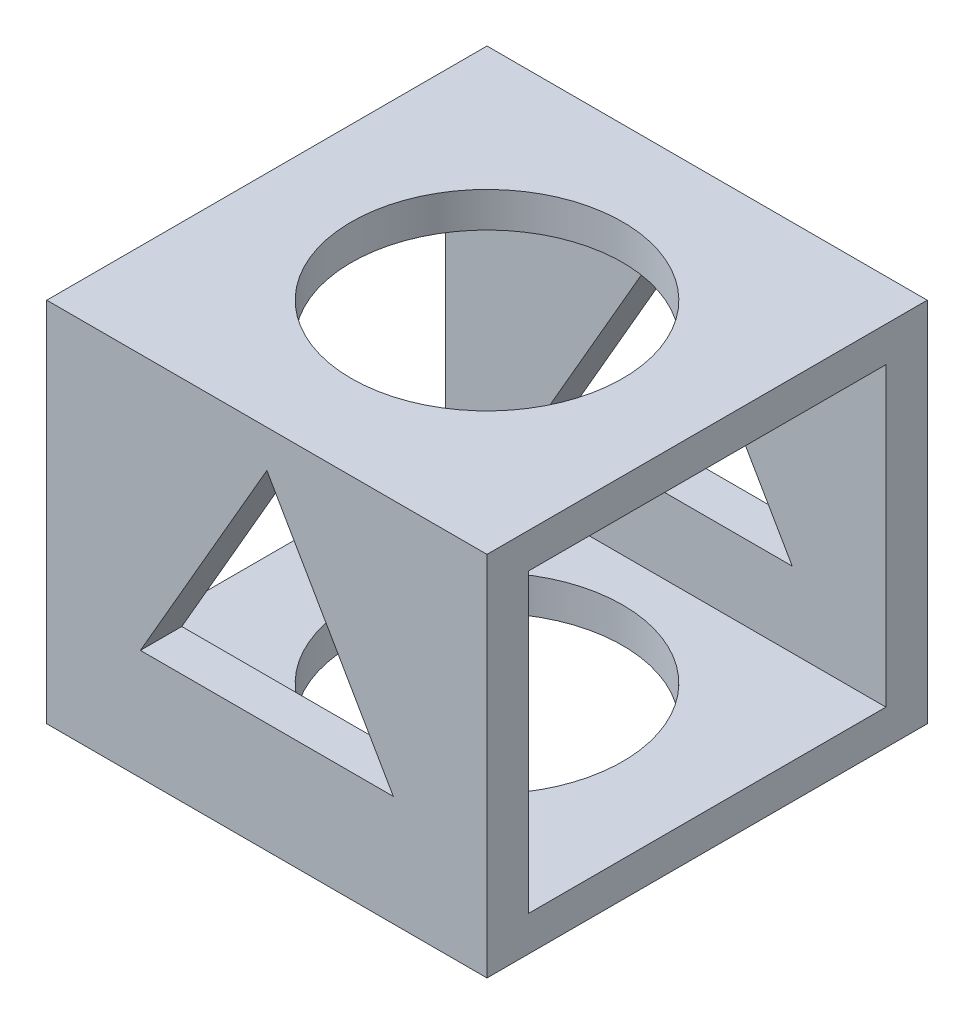
ISO-10303-21;
HEADER;
FILE_DESCRIPTION(('STEP AP214'),'2;1');
FILE_NAME('part.step','',(''),(''),'','','');
FILE_SCHEMA(('AUTOMOTIVE_DESIGN { 1 0 10303 214 1 1 1 1 }'));
ENDSEC;
DATA;
#1=APPLICATION_CONTEXT('core data for automotive mechanical design processes');
#2=APPLICATION_PROTOCOL_DEFINITION('international standard','automotive_design',2000,#1);
#3=PRODUCT_CONTEXT('',#1,'mechanical');
#4=PRODUCT('Part','Part','',(#3));
#5=PRODUCT_RELATED_PRODUCT_CATEGORY('part','',(#4));
#6=PRODUCT_DEFINITION_FORMATION('','',#4);
#7=PRODUCT_DEFINITION_CONTEXT('part definition',#1,'design');
#8=PRODUCT_DEFINITION('design','',#6,#7);
#9=PRODUCT_DEFINITION_SHAPE('','',#8);
#10=(LENGTH_UNIT() NAMED_UNIT(*) SI_UNIT(.MILLI.,.METRE.));
#11=(NAMED_UNIT(*) PLANE_ANGLE_UNIT() SI_UNIT($,.RADIAN.));
#12=(NAMED_UNIT(*) SI_UNIT($,.STERADIAN.) SOLID_ANGLE_UNIT());
#13=UNCERTAINTY_MEASURE_WITH_UNIT(LENGTH_MEASURE(1.E-05),#10,'distance_accuracy_value','');
#14=(GEOMETRIC_REPRESENTATION_CONTEXT(3) GLOBAL_UNCERTAINTY_ASSIGNED_CONTEXT((#13)) GLOBAL_UNIT_ASSIGNED_CONTEXT((#10,
#11,#12)) REPRESENTATION_CONTEXT('',''));
#15=CARTESIAN_POINT('',(0.,0.,0.));
#16=DIRECTION('',(0.,0.,1.));
#17=DIRECTION('',(1.,0.,0.));
#18=AXIS2_PLACEMENT_3D('',#15,#16,#17);
#19=CARTESIAN_POINT('',(43.7781022598842,-25.2752991243551,-76.2));
#20=DIRECTION('',(0.866025403784438,0.5,0.));
#21=DIRECTION('',(-0.5,0.866025403784438,0.));
#22=AXIS2_PLACEMENT_3D('',#19,#20,#21);
#23=PLANE('',#22);
#24=DIRECTION('',(0.,0.,1.));
#25=VECTOR('',#24,1.);
#26=CARTESIAN_POINT('',(43.7781022598842,-25.2752991243551,-76.2));
#27=LINE('',#26,#25);
#28=CARTESIAN_POINT('',(43.7781022598842,-25.2752991243551,-76.2));
#29=VERTEX_POINT('',#28);
#30=CARTESIAN_POINT('',(43.7781022598842,-25.2752991243551,-61.884513845509));
#31=VERTEX_POINT('',#30);
#32=EDGE_CURVE('E206',#29,#31,#27,.T.);
#33=ORIENTED_EDGE('',*,*,#32,.T.);
#34=DIRECTION('',(-0.5,0.866025403784438,0.));
#35=VECTOR('',#34,1.);
#36=CARTESIAN_POINT('',(43.7781022598842,-25.2752991243551,-61.884513845509));
#37=LINE('',#36,#35);
#38=CARTESIAN_POINT('',(0.,50.5505982487102,-61.884513845509));
#39=VERTEX_POINT('',#38);
#40=EDGE_CURVE('E184',#31,#39,#37,.T.);
#41=ORIENTED_EDGE('',*,*,#40,.T.);
#42=DIRECTION('',(0.,0.,1.));
#43=VECTOR('',#42,1.);
#44=CARTESIAN_POINT('',(0.,50.5505982487102,-76.2));
#45=LINE('',#44,#43);
#46=CARTESIAN_POINT('',(0.,50.5505982487102,-76.2));
#47=VERTEX_POINT('',#46);
#48=EDGE_CURVE('E215',#47,#39,#45,.T.);
#49=ORIENTED_EDGE('',*,*,#48,.F.);
#50=DIRECTION('',(-0.5,0.866025403784438,0.));
#51=VECTOR('',#50,1.);
#52=CARTESIAN_POINT('',(43.7781022598842,-25.2752991243551,-76.2));
#53=LINE('',#52,#51);
#54=EDGE_CURVE('E188',#29,#47,#53,.T.);
#55=ORIENTED_EDGE('',*,*,#54,.F.);
#56=EDGE_LOOP('',(#33,#41,#49,#55));
#57=FACE_BOUND('',#56,.T.);
#58=ADVANCED_FACE('F33',(#57),#23,.F.);
#59=CARTESIAN_POINT('',(-43.7781022598842,-25.2752991243551,-76.2));
#60=DIRECTION('',(0.,-1.,0.));
#61=DIRECTION('',(0.,0.,-1.));
#62=AXIS2_PLACEMENT_3D('',#59,#60,#61);
#63=PLANE('',#62);
#64=DIRECTION('',(0.,0.,1.));
#65=VECTOR('',#64,1.);
#66=CARTESIAN_POINT('',(-43.7781022598842,-25.2752991243551,-76.2));
#67=LINE('',#66,#65);
#68=CARTESIAN_POINT('',(-43.7781022598842,-25.2752991243551,-76.2));
#69=VERTEX_POINT('',#68);
#70=CARTESIAN_POINT('',(-43.7781022598842,-25.2752991243551,-61.884513845509));
#71=VERTEX_POINT('',#70);
#72=EDGE_CURVE('E211',#69,#71,#67,.T.);
#73=ORIENTED_EDGE('',*,*,#72,.T.);
#74=DIRECTION('',(1.,0.,0.));
#75=VECTOR('',#74,1.);
#76=CARTESIAN_POINT('',(-43.7781022598842,-25.2752991243551,-61.884513845509));
#77=LINE('',#76,#75);
#78=EDGE_CURVE('E181',#71,#31,#77,.T.);
#79=ORIENTED_EDGE('',*,*,#78,.T.);
#80=ORIENTED_EDGE('',*,*,#32,.F.);
#81=DIRECTION('',(1.,0.,0.));
#82=VECTOR('',#81,1.);
#83=CARTESIAN_POINT('',(-43.7781022598842,-25.2752991243551,-76.2));
#84=LINE('',#83,#82);
#85=EDGE_CURVE('E195',#69,#29,#84,.T.);
#86=ORIENTED_EDGE('',*,*,#85,.F.);
#87=EDGE_LOOP('',(#73,#79,#80,#86));
#88=FACE_BOUND('',#87,.T.);
#89=ADVANCED_FACE('F277',(#88),#63,.F.);
#90=CARTESIAN_POINT('',(0.,50.5505982487102,-76.2));
#91=DIRECTION('',(-0.866025403784439,0.5,0.));
#92=DIRECTION('',(-0.5,-0.866025403784439,0.));
#93=AXIS2_PLACEMENT_3D('',#90,#91,#92);
#94=PLANE('',#93);
#95=ORIENTED_EDGE('',*,*,#48,.T.);
#96=DIRECTION('',(-0.5,-0.866025403784439,0.));
#97=VECTOR('',#96,1.);
#98=CARTESIAN_POINT('',(0.,50.5505982487102,-61.884513845509));
#99=LINE('',#98,#97);
#100=EDGE_CURVE('E11',#39,#71,#99,.T.);
#101=ORIENTED_EDGE('',*,*,#100,.T.);
#102=ORIENTED_EDGE('',*,*,#72,.F.);
#103=DIRECTION('',(-0.5,-0.866025403784439,0.));
#104=VECTOR('',#103,1.);
#105=CARTESIAN_POINT('',(0.,50.5505982487102,-76.2));
#106=LINE('',#105,#104);
#107=EDGE_CURVE('E191',#47,#69,#106,.T.);
#108=ORIENTED_EDGE('',*,*,#107,.F.);
#109=EDGE_LOOP('',(#95,#101,#102,#108));
#110=FACE_BOUND('',#109,.T.);
#111=ADVANCED_FACE('F283',(#110),#94,.F.);
#112=CARTESIAN_POINT('',(76.2,-63.5,76.2));
#113=DIRECTION('',(-1.,0.,0.));
#114=DIRECTION('',(0.,0.,1.));
#115=AXIS2_PLACEMENT_3D('',#112,#113,#114);
#116=PLANE('',#115);
#117=DIRECTION('',(0.,0.,1.));
#118=VECTOR('',#117,1.);
#119=CARTESIAN_POINT('',(76.2,51.3319522360152,61.884513845509));
#120=LINE('',#119,#118);
#121=CARTESIAN_POINT('',(76.2,51.3319522360152,-61.884513845509));
#122=VERTEX_POINT('',#121);
#123=CARTESIAN_POINT('',(76.2,51.3319522360152,61.884513845509));
#124=VERTEX_POINT('',#123);
#125=EDGE_CURVE('E166',#122,#124,#120,.T.);
#126=ORIENTED_EDGE('',*,*,#125,.F.);
#127=DIRECTION('',(0.,1.,0.));
#128=VECTOR('',#127,1.);
#129=CARTESIAN_POINT('',(76.2,-51.3319522360152,-61.884513845509));
#130=LINE('',#129,#128);
#131=CARTESIAN_POINT('',(76.2,-51.3319522360152,-61.884513845509));
#132=VERTEX_POINT('',#131);
#133=EDGE_CURVE('E49',#132,#122,#130,.T.);
#134=ORIENTED_EDGE('',*,*,#133,.F.);
#135=DIRECTION('',(0.,0.,-1.));
#136=VECTOR('',#135,1.);
#137=CARTESIAN_POINT('',(76.2,-51.3319522360152,61.884513845509));
#138=LINE('',#137,#136);
#139=CARTESIAN_POINT('',(76.2,-51.3319522360152,61.884513845509));
#140=VERTEX_POINT('',#139);
#141=EDGE_CURVE('E154',#140,#132,#138,.T.);
#142=ORIENTED_EDGE('',*,*,#141,.F.);
#143=DIRECTION('',(0.,-1.,0.));
#144=VECTOR('',#143,1.);
#145=CARTESIAN_POINT('',(76.2,-51.3319522360152,61.884513845509));
#146=LINE('',#145,#144);
#147=EDGE_CURVE('E157',#124,#140,#146,.T.);
#148=ORIENTED_EDGE('',*,*,#147,.F.);
#149=EDGE_LOOP('',(#126,#134,#142,#148));
#150=FACE_BOUND('',#149,.T.);
#151=DIRECTION('',(0.,1.,0.));
#152=VECTOR('',#151,1.);
#153=CARTESIAN_POINT('',(76.2,-63.5,-76.2));
#154=LINE('',#153,#152);
#155=CARTESIAN_POINT('',(76.2,-63.5,-76.2));
#156=VERTEX_POINT('',#155);
#157=CARTESIAN_POINT('',(76.2,63.5,-76.2));
#158=VERTEX_POINT('',#157);
#159=EDGE_CURVE('E209',#156,#158,#154,.T.);
#160=ORIENTED_EDGE('',*,*,#159,.T.);
#161=DIRECTION('',(0.,0.,-1.));
#162=VECTOR('',#161,1.);
#163=CARTESIAN_POINT('',(76.2,63.5,76.2));
#164=LINE('',#163,#162);
#165=CARTESIAN_POINT('',(76.2,63.5,76.2));
#166=VERTEX_POINT('',#165);
#167=EDGE_CURVE('E244',#166,#158,#164,.T.);
#168=ORIENTED_EDGE('',*,*,#167,.F.);
#169=DIRECTION('',(0.,1.,0.));
#170=VECTOR('',#169,1.);
#171=CARTESIAN_POINT('',(76.2,-63.5,76.2));
#172=LINE('',#171,#170);
#173=CARTESIAN_POINT('',(76.2,-63.5,76.2));
#174=VERTEX_POINT('',#173);
#175=EDGE_CURVE('E218',#174,#166,#172,.T.);
#176=ORIENTED_EDGE('',*,*,#175,.F.);
#177=DIRECTION('',(0.,0.,-1.));
#178=VECTOR('',#177,1.);
#179=CARTESIAN_POINT('',(76.2,-63.5,76.2));
#180=LINE('',#179,#178);
#181=EDGE_CURVE('E228',#174,#156,#180,.T.);
#182=ORIENTED_EDGE('',*,*,#181,.T.);
#183=EDGE_LOOP('',(#160,#168,#176,#182));
#184=FACE_BOUND('',#183,.T.);
#185=ADVANCED_FACE('F35',(#150,#184),#116,.F.);
#186=CARTESIAN_POINT('',(-76.2,63.5,76.2));
#187=DIRECTION('',(0.,-1.,0.));
#188=DIRECTION('',(0.,0.,-1.));
#189=AXIS2_PLACEMENT_3D('',#186,#187,#188);
#190=PLANE('',#189);
#191=CARTESIAN_POINT('',(0.,63.5,0.));
#192=DIRECTION('',(0.,1.,0.));
#193=DIRECTION('',(0.,0.,1.));
#194=AXIS2_PLACEMENT_3D('',#191,#192,#193);
#195=CIRCLE('',#194,46.9608561348397);
#196=CARTESIAN_POINT('',(0.,63.5,46.9608561348397));
#197=VERTEX_POINT('',#196);
#198=EDGE_CURVE('E316',#197,#197,#195,.T.);
#199=ORIENTED_EDGE('',*,*,#198,.F.);
#200=EDGE_LOOP('',(#199));
#201=FACE_BOUND('',#200,.T.);
#202=DIRECTION('',(-1.,0.,0.));
#203=VECTOR('',#202,1.);
#204=CARTESIAN_POINT('',(-76.2,63.5,-76.2));
#205=LINE('',#204,#203);
#206=CARTESIAN_POINT('',(-76.2,63.5,-76.2));
#207=VERTEX_POINT('',#206);
#208=EDGE_CURVE('E231',#158,#207,#205,.T.);
#209=ORIENTED_EDGE('',*,*,#208,.T.);
#210=DIRECTION('',(0.,0.,-1.));
#211=VECTOR('',#210,1.);
#212=CARTESIAN_POINT('',(-76.2,63.5,76.2));
#213=LINE('',#212,#211);
#214=CARTESIAN_POINT('',(-76.2,63.5,76.2));
#215=VERTEX_POINT('',#214);
#216=EDGE_CURVE('E241',#215,#207,#213,.T.);
#217=ORIENTED_EDGE('',*,*,#216,.F.);
#218=DIRECTION('',(-1.,0.,0.));
#219=VECTOR('',#218,1.);
#220=CARTESIAN_POINT('',(-76.2,63.5,76.2));
#221=LINE('',#220,#219);
#222=EDGE_CURVE('E221',#166,#215,#221,.T.);
#223=ORIENTED_EDGE('',*,*,#222,.F.);
#224=ORIENTED_EDGE('',*,*,#167,.T.);
#225=EDGE_LOOP('',(#209,#217,#223,#224));
#226=FACE_BOUND('',#225,.T.);
#227=ADVANCED_FACE('F306',(#201,#226),#190,.F.);
#228=CARTESIAN_POINT('',(-76.2,-63.5,76.2));
#229=DIRECTION('',(1.,0.,0.));
#230=DIRECTION('',(0.,0.,-1.));
#231=AXIS2_PLACEMENT_3D('',#228,#229,#230);
#232=PLANE('',#231);
#233=DIRECTION('',(0.,0.,-1.));
#234=VECTOR('',#233,1.);
#235=CARTESIAN_POINT('',(-76.2,-51.3319522360152,61.884513845509));
#236=LINE('',#235,#234);
#237=CARTESIAN_POINT('',(-76.2,-51.3319522360152,61.884513845509));
#238=VERTEX_POINT('',#237);
#239=CARTESIAN_POINT('',(-76.2,-51.3319522360152,-61.884513845509));
#240=VERTEX_POINT('',#239);
#241=EDGE_CURVE('E144',#238,#240,#236,.T.);
#242=ORIENTED_EDGE('',*,*,#241,.T.);
#243=DIRECTION('',(0.,1.,0.));
#244=VECTOR('',#243,1.);
#245=CARTESIAN_POINT('',(-76.2,-51.3319522360152,-61.884513845509));
#246=LINE('',#245,#244);
#247=CARTESIAN_POINT('',(-76.2,51.3319522360152,-61.884513845509));
#248=VERTEX_POINT('',#247);
#249=EDGE_CURVE('E138',#240,#248,#246,.T.);
#250=ORIENTED_EDGE('',*,*,#249,.T.);
#251=DIRECTION('',(0.,0.,1.));
#252=VECTOR('',#251,1.);
#253=CARTESIAN_POINT('',(-76.2,51.3319522360152,61.884513845509));
#254=LINE('',#253,#252);
#255=CARTESIAN_POINT('',(-76.2,51.3319522360152,61.884513845509));
#256=VERTEX_POINT('',#255);
#257=EDGE_CURVE('E147',#248,#256,#254,.T.);
#258=ORIENTED_EDGE('',*,*,#257,.T.);
#259=DIRECTION('',(0.,-1.,0.));
#260=VECTOR('',#259,1.);
#261=CARTESIAN_POINT('',(-76.2,-51.3319522360152,61.884513845509));
#262=LINE('',#261,#260);
#263=EDGE_CURVE('E57',#256,#238,#262,.T.);
#264=ORIENTED_EDGE('',*,*,#263,.T.);
#265=EDGE_LOOP('',(#242,#250,#258,#264));
#266=FACE_BOUND('',#265,.T.);
#267=DIRECTION('',(0.,-1.,0.));
#268=VECTOR('',#267,1.);
#269=CARTESIAN_POINT('',(-76.2,-63.5,-76.2));
#270=LINE('',#269,#268);
#271=CARTESIAN_POINT('',(-76.2,-63.5,-76.2));
#272=VERTEX_POINT('',#271);
#273=EDGE_CURVE('E233',#207,#272,#270,.T.);
#274=ORIENTED_EDGE('',*,*,#273,.T.);
#275=DIRECTION('',(0.,0.,-1.));
#276=VECTOR('',#275,1.);
#277=CARTESIAN_POINT('',(-76.2,-63.5,76.2));
#278=LINE('',#277,#276);
#279=CARTESIAN_POINT('',(-76.2,-63.5,76.2));
#280=VERTEX_POINT('',#279);
#281=EDGE_CURVE('E238',#280,#272,#278,.T.);
#282=ORIENTED_EDGE('',*,*,#281,.F.);
#283=DIRECTION('',(0.,-1.,0.));
#284=VECTOR('',#283,1.);
#285=CARTESIAN_POINT('',(-76.2,-63.5,76.2));
#286=LINE('',#285,#284);
#287=EDGE_CURVE('E224',#215,#280,#286,.T.);
#288=ORIENTED_EDGE('',*,*,#287,.F.);
#289=ORIENTED_EDGE('',*,*,#216,.T.);
#290=EDGE_LOOP('',(#274,#282,#288,#289));
#291=FACE_BOUND('',#290,.T.);
#292=ADVANCED_FACE('F151',(#266,#291),#232,.F.);
#293=CARTESIAN_POINT('',(-76.2,-63.5,76.2));
#294=DIRECTION('',(0.,1.,0.));
#295=DIRECTION('',(0.,0.,1.));
#296=AXIS2_PLACEMENT_3D('',#293,#294,#295);
#297=PLANE('',#296);
#298=CARTESIAN_POINT('',(0.,-63.5,0.));
#299=DIRECTION('',(0.,1.,0.));
#300=DIRECTION('',(0.,0.,1.));
#301=AXIS2_PLACEMENT_3D('',#298,#299,#300);
#302=CIRCLE('',#301,46.9608561348397);
#303=CARTESIAN_POINT('',(0.,-63.5,46.9608561348397));
#304=VERTEX_POINT('',#303);
#305=EDGE_CURVE('E330',#304,#304,#302,.T.);
#306=ORIENTED_EDGE('',*,*,#305,.T.);
#307=EDGE_LOOP('',(#306));
#308=FACE_BOUND('',#307,.T.);
#309=DIRECTION('',(1.,0.,0.));
#310=VECTOR('',#309,1.);
#311=CARTESIAN_POINT('',(-76.2,-63.5,-76.2));
#312=LINE('',#311,#310);
#313=EDGE_CURVE('E222',#272,#156,#312,.T.);
#314=ORIENTED_EDGE('',*,*,#313,.T.);
#315=ORIENTED_EDGE('',*,*,#181,.F.);
#316=DIRECTION('',(1.,0.,0.));
#317=VECTOR('',#316,1.);
#318=CARTESIAN_POINT('',(-76.2,-63.5,76.2));
#319=LINE('',#318,#317);
#320=EDGE_CURVE('E226',#280,#174,#319,.T.);
#321=ORIENTED_EDGE('',*,*,#320,.F.);
#322=ORIENTED_EDGE('',*,*,#281,.T.);
#323=EDGE_LOOP('',(#314,#315,#321,#322));
#324=FACE_BOUND('',#323,.T.);
#325=ADVANCED_FACE('F299',(#308,#324),#297,.F.);
#326=CARTESIAN_POINT('',(0.,0.,76.2));
#327=DIRECTION('',(0.,0.,-1.));
#328=DIRECTION('',(-1.,0.,0.));
#329=AXIS2_PLACEMENT_3D('',#326,#327,#328);
#330=PLANE('',#329);
#331=DIRECTION('',(-0.5,-0.866025403784439,0.));
#332=VECTOR('',#331,1.);
#333=CARTESIAN_POINT('',(0.,50.5505982487102,76.2));
#334=LINE('',#333,#332);
#335=CARTESIAN_POINT('',(0.,50.5505982487102,76.2));
#336=VERTEX_POINT('',#335);
#337=CARTESIAN_POINT('',(-43.7781022598842,-25.2752991243551,76.2));
#338=VERTEX_POINT('',#337);
#339=EDGE_CURVE('E201',#336,#338,#334,.T.);
#340=ORIENTED_EDGE('',*,*,#339,.F.);
#341=DIRECTION('',(-0.5,0.866025403784438,0.));
#342=VECTOR('',#341,1.);
#343=CARTESIAN_POINT('',(43.7781022598842,-25.2752991243551,76.2));
#344=LINE('',#343,#342);
#345=CARTESIAN_POINT('',(43.7781022598842,-25.2752991243551,76.2));
#346=VERTEX_POINT('',#345);
#347=EDGE_CURVE('E187',#346,#336,#344,.T.);
#348=ORIENTED_EDGE('',*,*,#347,.F.);
#349=DIRECTION('',(1.,0.,0.));
#350=VECTOR('',#349,1.);
#351=CARTESIAN_POINT('',(-43.7781022598842,-25.2752991243551,76.2));
#352=LINE('',#351,#350);
#353=EDGE_CURVE('E192',#338,#346,#352,.T.);
#354=ORIENTED_EDGE('',*,*,#353,.F.);
#355=EDGE_LOOP('',(#340,#348,#354));
#356=FACE_BOUND('',#355,.T.);
#357=ORIENTED_EDGE('',*,*,#175,.T.);
#358=ORIENTED_EDGE('',*,*,#222,.T.);
#359=ORIENTED_EDGE('',*,*,#287,.T.);
#360=ORIENTED_EDGE('',*,*,#320,.T.);
#361=EDGE_LOOP('',(#357,#358,#359,#360));
#362=FACE_BOUND('',#361,.T.);
#363=ADVANCED_FACE('F260',(#356,#362),#330,.F.);
#364=CARTESIAN_POINT('',(0.,0.,-76.2));
#365=DIRECTION('',(0.,0.,-1.));
#366=DIRECTION('',(-1.,0.,0.));
#367=AXIS2_PLACEMENT_3D('',#364,#365,#366);
#368=PLANE('',#367);
#369=ORIENTED_EDGE('',*,*,#54,.T.);
#370=ORIENTED_EDGE('',*,*,#107,.T.);
#371=ORIENTED_EDGE('',*,*,#85,.T.);
#372=EDGE_LOOP('',(#369,#370,#371));
#373=FACE_BOUND('',#372,.T.);
#374=ORIENTED_EDGE('',*,*,#159,.F.);
#375=ORIENTED_EDGE('',*,*,#313,.F.);
#376=ORIENTED_EDGE('',*,*,#273,.F.);
#377=ORIENTED_EDGE('',*,*,#208,.F.);
#378=EDGE_LOOP('',(#374,#375,#376,#377));
#379=FACE_BOUND('',#378,.T.);
#380=ADVANCED_FACE('F289',(#373,#379),#368,.T.);
#381=CARTESIAN_POINT('',(0.,50.5505982487102,61.884513845509));
#382=VERTEX_POINT('',#381);
#383=EDGE_CURVE('E198',#382,#336,#45,.T.);
#384=ORIENTED_EDGE('',*,*,#383,.F.);
#385=DIRECTION('',(0.5,-0.866025403784438,0.));
#386=VECTOR('',#385,1.);
#387=CARTESIAN_POINT('',(43.7781022598842,-25.2752991243551,61.884513845509));
#388=LINE('',#387,#386);
#389=CARTESIAN_POINT('',(43.7781022598842,-25.2752991243551,61.884513845509));
#390=VERTEX_POINT('',#389);
#391=EDGE_CURVE('E178',#382,#390,#388,.T.);
#392=ORIENTED_EDGE('',*,*,#391,.T.);
#393=EDGE_CURVE('E210',#390,#346,#27,.T.);
#394=ORIENTED_EDGE('',*,*,#393,.T.);
#395=ORIENTED_EDGE('',*,*,#347,.T.);
#396=EDGE_LOOP('',(#384,#392,#394,#395));
#397=FACE_BOUND('',#396,.T.);
#398=ADVANCED_FACE('F254',(#397),#23,.F.);
#399=ORIENTED_EDGE('',*,*,#393,.F.);
#400=DIRECTION('',(-1.,0.,0.));
#401=VECTOR('',#400,1.);
#402=CARTESIAN_POINT('',(-43.7781022598842,-25.2752991243551,61.884513845509));
#403=LINE('',#402,#401);
#404=CARTESIAN_POINT('',(-43.7781022598842,-25.2752991243551,61.884513845509));
#405=VERTEX_POINT('',#404);
#406=EDGE_CURVE('E172',#390,#405,#403,.T.);
#407=ORIENTED_EDGE('',*,*,#406,.T.);
#408=EDGE_CURVE('E214',#405,#338,#67,.T.);
#409=ORIENTED_EDGE('',*,*,#408,.T.);
#410=ORIENTED_EDGE('',*,*,#353,.T.);
#411=EDGE_LOOP('',(#399,#407,#409,#410));
#412=FACE_BOUND('',#411,.T.);
#413=ADVANCED_FACE('F263',(#412),#63,.F.);
#414=ORIENTED_EDGE('',*,*,#408,.F.);
#415=DIRECTION('',(0.5,0.866025403784439,0.));
#416=VECTOR('',#415,1.);
#417=CARTESIAN_POINT('',(0.,50.5505982487102,61.884513845509));
#418=LINE('',#417,#416);
#419=EDGE_CURVE('E42',#405,#382,#418,.T.);
#420=ORIENTED_EDGE('',*,*,#419,.T.);
#421=ORIENTED_EDGE('',*,*,#383,.T.);
#422=ORIENTED_EDGE('',*,*,#339,.T.);
#423=EDGE_LOOP('',(#414,#420,#421,#422));
#424=FACE_BOUND('',#423,.T.);
#425=ADVANCED_FACE('F251',(#424),#94,.F.);
#426=CARTESIAN_POINT('',(-76.2,-51.3319522360152,-61.884513845509));
#427=DIRECTION('',(0.,0.,-1.));
#428=DIRECTION('',(-1.,0.,0.));
#429=AXIS2_PLACEMENT_3D('',#426,#427,#428);
#430=PLANE('',#429);
#431=ORIENTED_EDGE('',*,*,#133,.T.);
#432=DIRECTION('',(1.,0.,0.));
#433=VECTOR('',#432,1.);
#434=CARTESIAN_POINT('',(-76.2,51.3319522360152,-61.884513845509));
#435=LINE('',#434,#433);
#436=EDGE_CURVE('E133',#248,#122,#435,.T.);
#437=ORIENTED_EDGE('',*,*,#436,.F.);
#438=ORIENTED_EDGE('',*,*,#249,.F.);
#439=DIRECTION('',(1.,0.,0.));
#440=VECTOR('',#439,1.);
#441=CARTESIAN_POINT('',(-76.2,-51.3319522360152,-61.884513845509));
#442=LINE('',#441,#440);
#443=EDGE_CURVE('E170',#240,#132,#442,.T.);
#444=ORIENTED_EDGE('',*,*,#443,.T.);
#445=EDGE_LOOP('',(#431,#437,#438,#444));
#446=FACE_BOUND('',#445,.T.);
#447=ORIENTED_EDGE('',*,*,#78,.F.);
#448=ORIENTED_EDGE('',*,*,#100,.F.);
#449=ORIENTED_EDGE('',*,*,#40,.F.);
#450=EDGE_LOOP('',(#447,#448,#449));
#451=FACE_BOUND('',#450,.T.);
#452=ADVANCED_FACE('F135',(#446,#451),#430,.F.);
#453=CARTESIAN_POINT('',(-76.2,-51.3319522360152,61.884513845509));
#454=DIRECTION('',(0.,0.,1.));
#455=DIRECTION('',(1.,0.,0.));
#456=AXIS2_PLACEMENT_3D('',#453,#454,#455);
#457=PLANE('',#456);
#458=ORIENTED_EDGE('',*,*,#147,.T.);
#459=DIRECTION('',(1.,0.,0.));
#460=VECTOR('',#459,1.);
#461=CARTESIAN_POINT('',(-76.2,-51.3319522360152,61.884513845509));
#462=LINE('',#461,#460);
#463=EDGE_CURVE('E173',#238,#140,#462,.T.);
#464=ORIENTED_EDGE('',*,*,#463,.F.);
#465=ORIENTED_EDGE('',*,*,#263,.F.);
#466=DIRECTION('',(1.,0.,0.));
#467=VECTOR('',#466,1.);
#468=CARTESIAN_POINT('',(-76.2,51.3319522360152,61.884513845509));
#469=LINE('',#468,#467);
#470=EDGE_CURVE('E143',#256,#124,#469,.T.);
#471=ORIENTED_EDGE('',*,*,#470,.T.);
#472=EDGE_LOOP('',(#458,#464,#465,#471));
#473=FACE_BOUND('',#472,.T.);
#474=ORIENTED_EDGE('',*,*,#419,.F.);
#475=ORIENTED_EDGE('',*,*,#406,.F.);
#476=ORIENTED_EDGE('',*,*,#391,.F.);
#477=EDGE_LOOP('',(#474,#475,#476));
#478=FACE_BOUND('',#477,.T.);
#479=ADVANCED_FACE('F264',(#473,#478),#457,.F.);
#480=CARTESIAN_POINT('',(-76.2,-51.3319522360152,61.884513845509));
#481=DIRECTION('',(0.,-1.,0.));
#482=DIRECTION('',(0.,0.,-1.));
#483=AXIS2_PLACEMENT_3D('',#480,#481,#482);
#484=PLANE('',#483);
#485=CARTESIAN_POINT('',(0.,-51.3319522360152,0.));
#486=DIRECTION('',(0.,-1.,0.));
#487=DIRECTION('',(0.,0.,-1.));
#488=AXIS2_PLACEMENT_3D('',#485,#486,#487);
#489=CIRCLE('',#488,46.9608561348397);
#490=CARTESIAN_POINT('',(0.,-51.3319522360152,-46.9608561348397));
#491=VERTEX_POINT('',#490);
#492=EDGE_CURVE('E160',#491,#491,#489,.T.);
#493=ORIENTED_EDGE('',*,*,#492,.T.);
#494=EDGE_LOOP('',(#493));
#495=FACE_BOUND('',#494,.T.);
#496=ORIENTED_EDGE('',*,*,#141,.T.);
#497=ORIENTED_EDGE('',*,*,#443,.F.);
#498=ORIENTED_EDGE('',*,*,#241,.F.);
#499=ORIENTED_EDGE('',*,*,#463,.T.);
#500=EDGE_LOOP('',(#496,#497,#498,#499));
#501=FACE_BOUND('',#500,.T.);
#502=ADVANCED_FACE('F266',(#495,#501),#484,.F.);
#503=CARTESIAN_POINT('',(-76.2,51.3319522360152,61.884513845509));
#504=DIRECTION('',(0.,1.,0.));
#505=DIRECTION('',(0.,0.,1.));
#506=AXIS2_PLACEMENT_3D('',#503,#504,#505);
#507=PLANE('',#506);
#508=CARTESIAN_POINT('',(0.,51.3319522360152,0.));
#509=DIRECTION('',(0.,1.,0.));
#510=DIRECTION('',(0.,0.,1.));
#511=AXIS2_PLACEMENT_3D('',#508,#509,#510);
#512=CIRCLE('',#511,46.9608561348397);
#513=CARTESIAN_POINT('',(0.,51.3319522360152,46.9608561348397));
#514=VERTEX_POINT('',#513);
#515=EDGE_CURVE('E37',#514,#514,#512,.T.);
#516=ORIENTED_EDGE('',*,*,#515,.T.);
#517=EDGE_LOOP('',(#516));
#518=FACE_BOUND('',#517,.T.);
#519=ORIENTED_EDGE('',*,*,#125,.T.);
#520=ORIENTED_EDGE('',*,*,#470,.F.);
#521=ORIENTED_EDGE('',*,*,#257,.F.);
#522=ORIENTED_EDGE('',*,*,#436,.T.);
#523=EDGE_LOOP('',(#519,#520,#521,#522));
#524=FACE_BOUND('',#523,.T.);
#525=ADVANCED_FACE('F148',(#518,#524),#507,.F.);
#526=CARTESIAN_POINT('',(0.,-63.5,0.));
#527=DIRECTION('',(0.,1.,0.));
#528=DIRECTION('',(0.,0.,1.));
#529=AXIS2_PLACEMENT_3D('',#526,#527,#528);
#530=CYLINDRICAL_SURFACE('',#529,46.9608561348397);
#531=ORIENTED_EDGE('',*,*,#198,.T.);
#532=EDGE_LOOP('',(#531));
#533=FACE_BOUND('',#532,.T.);
#534=ORIENTED_EDGE('',*,*,#515,.F.);
#535=EDGE_LOOP('',(#534));
#536=FACE_BOUND('',#535,.T.);
#537=ADVANCED_FACE('F343',(#533,#536),#530,.F.);
#538=ORIENTED_EDGE('',*,*,#305,.F.);
#539=EDGE_LOOP('',(#538));
#540=FACE_BOUND('',#539,.T.);
#541=ORIENTED_EDGE('',*,*,#492,.F.);
#542=EDGE_LOOP('',(#541));
#543=FACE_BOUND('',#542,.T.);
#544=ADVANCED_FACE('F341',(#540,#543),#530,.F.);
#545=CLOSED_SHELL('',(#58,#89,#111,#185,#227,#292,#325,#363,#380,#398,#413,#425,#452,#479,#502,
#525,#537,#544));
#546=MANIFOLD_SOLID_BREP('B2',#545);
#547=ADVANCED_BREP_SHAPE_REPRESENTATION('',(#18,#546),#14);
#548=SHAPE_DEFINITION_REPRESENTATION(#9,#547);
ENDSEC;
END-ISO-10303-21;
